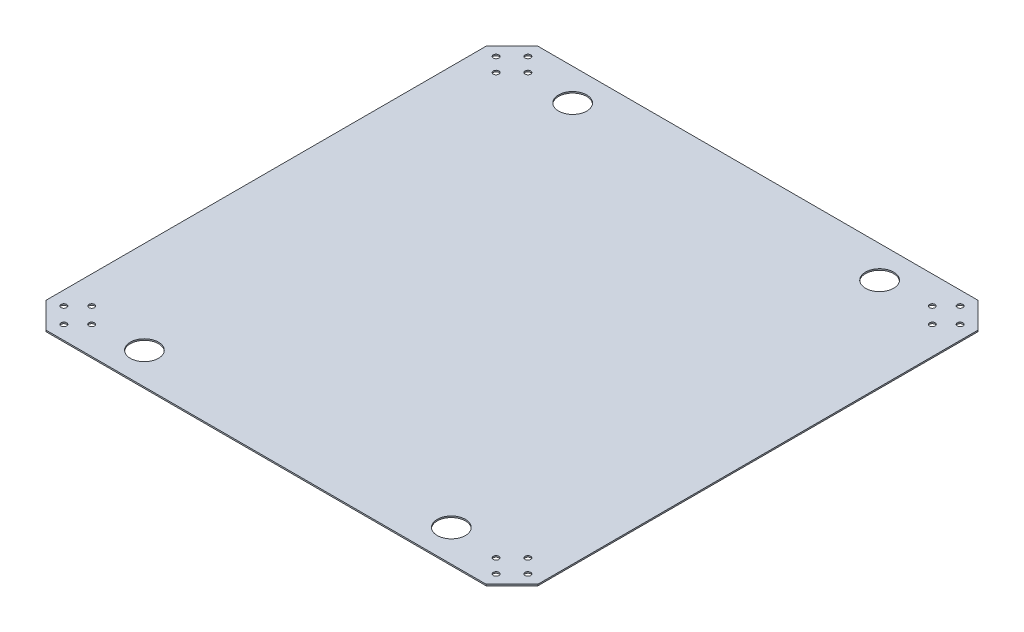
ISO-10303-21;
HEADER;
FILE_DESCRIPTION(('STEP AP214'),'2;1');
FILE_NAME('part.step','',(''),(''),'','','');
FILE_SCHEMA(('AUTOMOTIVE_DESIGN { 1 0 10303 214 1 1 1 1 }'));
ENDSEC;
DATA;
#1=APPLICATION_CONTEXT('core data for automotive mechanical design processes');
#2=APPLICATION_PROTOCOL_DEFINITION('international standard','automotive_design',2000,#1);
#3=PRODUCT_CONTEXT('',#1,'mechanical');
#4=PRODUCT('Part','Part','',(#3));
#5=PRODUCT_RELATED_PRODUCT_CATEGORY('part','',(#4));
#6=PRODUCT_DEFINITION_FORMATION('','',#4);
#7=PRODUCT_DEFINITION_CONTEXT('part definition',#1,'design');
#8=PRODUCT_DEFINITION('design','',#6,#7);
#9=PRODUCT_DEFINITION_SHAPE('','',#8);
#10=(LENGTH_UNIT() NAMED_UNIT(*) SI_UNIT(.MILLI.,.METRE.));
#11=(NAMED_UNIT(*) PLANE_ANGLE_UNIT() SI_UNIT($,.RADIAN.));
#12=(NAMED_UNIT(*) SI_UNIT($,.STERADIAN.) SOLID_ANGLE_UNIT());
#13=UNCERTAINTY_MEASURE_WITH_UNIT(LENGTH_MEASURE(1.E-05),#10,'distance_accuracy_value','');
#14=(GEOMETRIC_REPRESENTATION_CONTEXT(3) GLOBAL_UNCERTAINTY_ASSIGNED_CONTEXT((#13)) GLOBAL_UNIT_ASSIGNED_CONTEXT((#10,
#11,#12)) REPRESENTATION_CONTEXT('',''));
#15=CARTESIAN_POINT('',(0.,0.,0.));
#16=DIRECTION('',(0.,0.,1.));
#17=DIRECTION('',(1.,0.,0.));
#18=AXIS2_PLACEMENT_3D('',#15,#16,#17);
#19=CARTESIAN_POINT('',(0.,1.,174.999999999988));
#20=DIRECTION('',(0.,0.,-1.));
#21=DIRECTION('',(-1.,0.,0.));
#22=AXIS2_PLACEMENT_3D('',#19,#20,#21);
#23=PLANE('',#22);
#24=DIRECTION('',(1.,0.,0.));
#25=VECTOR('',#24,1.);
#26=CARTESIAN_POINT('',(0.,0.,174.999999999988));
#27=LINE('',#26,#25);
#28=CARTESIAN_POINT('',(-156.614999999998,0.,174.999999999989));
#29=VERTEX_POINT('',#28);
#30=CARTESIAN_POINT('',(156.615,0.,174.999999999988));
#31=VERTEX_POINT('',#30);
#32=EDGE_CURVE('E190',#29,#31,#27,.T.);
#33=ORIENTED_EDGE('',*,*,#32,.T.);
#34=DIRECTION('',(0.,-1.,0.));
#35=VECTOR('',#34,1.);
#36=CARTESIAN_POINT('',(156.615,1.,174.999999999988));
#37=LINE('',#36,#35);
#38=CARTESIAN_POINT('',(156.615,1.,174.999999999988));
#39=VERTEX_POINT('',#38);
#40=EDGE_CURVE('E11',#39,#31,#37,.T.);
#41=ORIENTED_EDGE('',*,*,#40,.F.);
#42=DIRECTION('',(1.,0.,0.));
#43=VECTOR('',#42,1.);
#44=CARTESIAN_POINT('',(0.,1.,174.999999999988));
#45=LINE('',#44,#43);
#46=CARTESIAN_POINT('',(-156.614999999998,1.,174.999999999989));
#47=VERTEX_POINT('',#46);
#48=EDGE_CURVE('E268',#47,#39,#45,.T.);
#49=ORIENTED_EDGE('',*,*,#48,.F.);
#50=DIRECTION('',(0.,-1.,0.));
#51=VECTOR('',#50,1.);
#52=CARTESIAN_POINT('',(-156.614999999998,1.,174.999999999989));
#53=LINE('',#52,#51);
#54=EDGE_CURVE('E189',#47,#29,#53,.T.);
#55=ORIENTED_EDGE('',*,*,#54,.T.);
#56=EDGE_LOOP('',(#33,#41,#49,#55));
#57=FACE_BOUND('',#56,.T.);
#58=ADVANCED_FACE('F34',(#57),#23,.F.);
#59=CARTESIAN_POINT('',(165.807500000004,1.,165.807500000004));
#60=DIRECTION('',(-0.707106781186547,0.,-0.707106781186547));
#61=DIRECTION('',(-0.707106781186548,0.,0.707106781186548));
#62=AXIS2_PLACEMENT_3D('',#59,#60,#61);
#63=PLANE('',#62);
#64=DIRECTION('',(0.707106781186548,0.,-0.707106781186548));
#65=VECTOR('',#64,1.);
#66=CARTESIAN_POINT('',(165.807500000004,0.,165.807500000004));
#67=LINE('',#66,#65);
#68=CARTESIAN_POINT('',(175.,0.,156.614999999988));
#69=VERTEX_POINT('',#68);
#70=EDGE_CURVE('E193',#31,#69,#67,.T.);
#71=ORIENTED_EDGE('',*,*,#70,.T.);
#72=DIRECTION('',(0.,-1.,0.));
#73=VECTOR('',#72,1.);
#74=CARTESIAN_POINT('',(175.,1.,156.614999999988));
#75=LINE('',#74,#73);
#76=CARTESIAN_POINT('',(175.,1.,156.614999999988));
#77=VERTEX_POINT('',#76);
#78=EDGE_CURVE('E42',#77,#69,#75,.T.);
#79=ORIENTED_EDGE('',*,*,#78,.F.);
#80=DIRECTION('',(0.707106781186548,0.,-0.707106781186548));
#81=VECTOR('',#80,1.);
#82=CARTESIAN_POINT('',(165.807500000004,1.,165.807500000004));
#83=LINE('',#82,#81);
#84=EDGE_CURVE('E93',#39,#77,#83,.T.);
#85=ORIENTED_EDGE('',*,*,#84,.F.);
#86=ORIENTED_EDGE('',*,*,#40,.T.);
#87=EDGE_LOOP('',(#71,#79,#85,#86));
#88=FACE_BOUND('',#87,.T.);
#89=ADVANCED_FACE('F281',(#88),#63,.F.);
#90=CARTESIAN_POINT('',(175.,1.,0.));
#91=DIRECTION('',(1.,0.,0.));
#92=DIRECTION('',(0.,0.,-1.));
#93=AXIS2_PLACEMENT_3D('',#90,#91,#92);
#94=PLANE('',#93);
#95=DIRECTION('',(0.,0.,1.));
#96=VECTOR('',#95,1.);
#97=CARTESIAN_POINT('',(175.,0.,0.));
#98=LINE('',#97,#96);
#99=CARTESIAN_POINT('',(175.,0.,-156.61500000001));
#100=VERTEX_POINT('',#99);
#101=EDGE_CURVE('E196',#100,#69,#98,.T.);
#102=ORIENTED_EDGE('',*,*,#101,.F.);
#103=DIRECTION('',(0.,-1.,0.));
#104=VECTOR('',#103,1.);
#105=CARTESIAN_POINT('',(175.,1.,-156.61500000001));
#106=LINE('',#105,#104);
#107=CARTESIAN_POINT('',(175.,1.,-156.61500000001));
#108=VERTEX_POINT('',#107);
#109=EDGE_CURVE('E274',#108,#100,#106,.T.);
#110=ORIENTED_EDGE('',*,*,#109,.F.);
#111=DIRECTION('',(0.,0.,1.));
#112=VECTOR('',#111,1.);
#113=CARTESIAN_POINT('',(175.,1.,0.));
#114=LINE('',#113,#112);
#115=EDGE_CURVE('E280',#108,#77,#114,.T.);
#116=ORIENTED_EDGE('',*,*,#115,.T.);
#117=ORIENTED_EDGE('',*,*,#78,.T.);
#118=EDGE_LOOP('',(#102,#110,#116,#117));
#119=FACE_BOUND('',#118,.T.);
#120=ADVANCED_FACE('F278',(#119),#94,.T.);
#121=CARTESIAN_POINT('',(165.807500000008,1.,-165.807500000008));
#122=DIRECTION('',(-0.707106781186547,0.,0.707106781186547));
#123=DIRECTION('',(0.707106781186548,0.,0.707106781186548));
#124=AXIS2_PLACEMENT_3D('',#121,#122,#123);
#125=PLANE('',#124);
#126=DIRECTION('',(-0.707106781186548,0.,-0.707106781186548));
#127=VECTOR('',#126,1.);
#128=CARTESIAN_POINT('',(165.807500000008,0.,-165.807500000008));
#129=LINE('',#128,#127);
#130=CARTESIAN_POINT('',(156.615,0.,-175.00000000001));
#131=VERTEX_POINT('',#130);
#132=EDGE_CURVE('E199',#100,#131,#129,.T.);
#133=ORIENTED_EDGE('',*,*,#132,.T.);
#134=DIRECTION('',(0.,-1.,0.));
#135=VECTOR('',#134,1.);
#136=CARTESIAN_POINT('',(156.615,1.,-175.00000000001));
#137=LINE('',#136,#135);
#138=CARTESIAN_POINT('',(156.615,1.,-175.00000000001));
#139=VERTEX_POINT('',#138);
#140=EDGE_CURVE('E272',#139,#131,#137,.T.);
#141=ORIENTED_EDGE('',*,*,#140,.F.);
#142=DIRECTION('',(-0.707106781186548,0.,-0.707106781186548));
#143=VECTOR('',#142,1.);
#144=CARTESIAN_POINT('',(165.807500000008,1.,-165.807500000008));
#145=LINE('',#144,#143);
#146=EDGE_CURVE('E293',#108,#139,#145,.T.);
#147=ORIENTED_EDGE('',*,*,#146,.F.);
#148=ORIENTED_EDGE('',*,*,#109,.T.);
#149=EDGE_LOOP('',(#133,#141,#147,#148));
#150=FACE_BOUND('',#149,.T.);
#151=ADVANCED_FACE('F291',(#150),#125,.F.);
#152=CARTESIAN_POINT('',(0.,1.,-175.00000000001));
#153=DIRECTION('',(0.,0.,-1.));
#154=DIRECTION('',(-1.,0.,0.));
#155=AXIS2_PLACEMENT_3D('',#152,#153,#154);
#156=PLANE('',#155);
#157=DIRECTION('',(1.,0.,0.));
#158=VECTOR('',#157,1.);
#159=CARTESIAN_POINT('',(0.,0.,-175.00000000001));
#160=LINE('',#159,#158);
#161=CARTESIAN_POINT('',(-156.614999999999,0.,-175.00000000001));
#162=VERTEX_POINT('',#161);
#163=EDGE_CURVE('E202',#162,#131,#160,.T.);
#164=ORIENTED_EDGE('',*,*,#163,.F.);
#165=DIRECTION('',(0.,-1.,0.));
#166=VECTOR('',#165,1.);
#167=CARTESIAN_POINT('',(-156.614999999999,1.,-175.00000000001));
#168=LINE('',#167,#166);
#169=CARTESIAN_POINT('',(-156.614999999999,1.,-175.00000000001));
#170=VERTEX_POINT('',#169);
#171=EDGE_CURVE('E121',#170,#162,#168,.T.);
#172=ORIENTED_EDGE('',*,*,#171,.F.);
#173=DIRECTION('',(1.,0.,0.));
#174=VECTOR('',#173,1.);
#175=CARTESIAN_POINT('',(0.,1.,-175.00000000001));
#176=LINE('',#175,#174);
#177=EDGE_CURVE('E114',#170,#139,#176,.T.);
#178=ORIENTED_EDGE('',*,*,#177,.T.);
#179=ORIENTED_EDGE('',*,*,#140,.T.);
#180=EDGE_LOOP('',(#164,#172,#178,#179));
#181=FACE_BOUND('',#180,.T.);
#182=ADVANCED_FACE('F299',(#181),#156,.T.);
#183=CARTESIAN_POINT('',(-165.807500000004,1.,-165.807500000004));
#184=DIRECTION('',(0.707106781186547,0.,0.707106781186547));
#185=DIRECTION('',(0.707106781186548,0.,-0.707106781186548));
#186=AXIS2_PLACEMENT_3D('',#183,#184,#185);
#187=PLANE('',#186);
#188=DIRECTION('',(-0.707106781186548,0.,0.707106781186548));
#189=VECTOR('',#188,1.);
#190=CARTESIAN_POINT('',(-165.807500000004,0.,-165.807500000004));
#191=LINE('',#190,#189);
#192=CARTESIAN_POINT('',(-174.999999999999,0.,-156.61500000001));
#193=VERTEX_POINT('',#192);
#194=EDGE_CURVE('E120',#162,#193,#191,.T.);
#195=ORIENTED_EDGE('',*,*,#194,.T.);
#196=DIRECTION('',(0.,-1.,0.));
#197=VECTOR('',#196,1.);
#198=CARTESIAN_POINT('',(-174.999999999999,1.,-156.61500000001));
#199=LINE('',#198,#197);
#200=CARTESIAN_POINT('',(-174.999999999999,1.,-156.61500000001));
#201=VERTEX_POINT('',#200);
#202=EDGE_CURVE('E117',#201,#193,#199,.T.);
#203=ORIENTED_EDGE('',*,*,#202,.F.);
#204=DIRECTION('',(-0.707106781186548,0.,0.707106781186548));
#205=VECTOR('',#204,1.);
#206=CARTESIAN_POINT('',(-165.807500000004,1.,-165.807500000004));
#207=LINE('',#206,#205);
#208=EDGE_CURVE('E107',#170,#201,#207,.T.);
#209=ORIENTED_EDGE('',*,*,#208,.F.);
#210=ORIENTED_EDGE('',*,*,#171,.T.);
#211=EDGE_LOOP('',(#195,#203,#209,#210));
#212=FACE_BOUND('',#211,.T.);
#213=ADVANCED_FACE('F118',(#212),#187,.F.);
#214=CARTESIAN_POINT('',(-174.999999999999,1.,0.));
#215=DIRECTION('',(1.,0.,0.));
#216=DIRECTION('',(0.,0.,-1.));
#217=AXIS2_PLACEMENT_3D('',#214,#215,#216);
#218=PLANE('',#217);
#219=DIRECTION('',(0.,0.,1.));
#220=VECTOR('',#219,1.);
#221=CARTESIAN_POINT('',(-174.999999999999,0.,0.));
#222=LINE('',#221,#220);
#223=CARTESIAN_POINT('',(-174.999999999999,0.,156.614999999989));
#224=VERTEX_POINT('',#223);
#225=EDGE_CURVE('E79',#193,#224,#222,.T.);
#226=ORIENTED_EDGE('',*,*,#225,.T.);
#227=DIRECTION('',(0.,-1.,0.));
#228=VECTOR('',#227,1.);
#229=CARTESIAN_POINT('',(-174.999999999999,1.,156.614999999989));
#230=LINE('',#229,#228);
#231=CARTESIAN_POINT('',(-174.999999999999,1.,156.614999999989));
#232=VERTEX_POINT('',#231);
#233=EDGE_CURVE('E122',#232,#224,#230,.T.);
#234=ORIENTED_EDGE('',*,*,#233,.F.);
#235=DIRECTION('',(0.,0.,1.));
#236=VECTOR('',#235,1.);
#237=CARTESIAN_POINT('',(-174.999999999999,1.,0.));
#238=LINE('',#237,#236);
#239=EDGE_CURVE('E112',#201,#232,#238,.T.);
#240=ORIENTED_EDGE('',*,*,#239,.F.);
#241=ORIENTED_EDGE('',*,*,#202,.T.);
#242=EDGE_LOOP('',(#226,#234,#240,#241));
#243=FACE_BOUND('',#242,.T.);
#244=ADVANCED_FACE('F124',(#243),#218,.F.);
#245=CARTESIAN_POINT('',(153.786572875261,1.,165.10050506338));
#246=DIRECTION('',(0.,-1.,0.));
#247=DIRECTION('',(0.,0.,-1.));
#248=AXIS2_PLACEMENT_3D('',#245,#246,#247);
#249=CYLINDRICAL_SURFACE('',#248,2.00000000000411);
#250=CARTESIAN_POINT('',(153.786572875261,1.,165.10050506338));
#251=DIRECTION('',(0.,1.,0.));
#252=DIRECTION('',(0.,0.,1.));
#253=AXIS2_PLACEMENT_3D('',#250,#251,#252);
#254=CIRCLE('',#253,2.00000000000411);
#255=CARTESIAN_POINT('',(153.786572875261,1.,167.100505063384));
#256=VERTEX_POINT('',#255);
#257=EDGE_CURVE('E183',#256,#256,#254,.T.);
#258=ORIENTED_EDGE('',*,*,#257,.T.);
#259=EDGE_LOOP('',(#258));
#260=FACE_BOUND('',#259,.T.);
#261=CARTESIAN_POINT('',(153.786572875261,0.,165.10050506338));
#262=DIRECTION('',(0.,1.,0.));
#263=DIRECTION('',(0.,0.,1.));
#264=AXIS2_PLACEMENT_3D('',#261,#262,#263);
#265=CIRCLE('',#264,2.00000000000411);
#266=CARTESIAN_POINT('',(153.786572875261,0.,167.100505063384));
#267=VERTEX_POINT('',#266);
#268=EDGE_CURVE('E262',#267,#267,#265,.T.);
#269=ORIENTED_EDGE('',*,*,#268,.F.);
#270=EDGE_LOOP('',(#269));
#271=FACE_BOUND('',#270,.T.);
#272=ADVANCED_FACE('F332',(#260,#271),#249,.F.);
#273=CARTESIAN_POINT('',(155.201010126783,1.,143.887077938643));
#274=DIRECTION('',(0.,-1.,0.));
#275=DIRECTION('',(0.,0.,-1.));
#276=AXIS2_PLACEMENT_3D('',#273,#274,#275);
#277=CYLINDRICAL_SURFACE('',#276,1.99999999999611);
#278=CARTESIAN_POINT('',(155.201010126783,1.,143.887077938643));
#279=DIRECTION('',(0.,1.,0.));
#280=DIRECTION('',(0.,0.,1.));
#281=AXIS2_PLACEMENT_3D('',#278,#279,#280);
#282=CIRCLE('',#281,1.99999999999611);
#283=CARTESIAN_POINT('',(155.201010126783,1.,145.887077938639));
#284=VERTEX_POINT('',#283);
#285=EDGE_CURVE('E180',#284,#284,#282,.T.);
#286=ORIENTED_EDGE('',*,*,#285,.T.);
#287=EDGE_LOOP('',(#286));
#288=FACE_BOUND('',#287,.T.);
#289=CARTESIAN_POINT('',(155.201010126783,0.,143.887077938643));
#290=DIRECTION('',(0.,1.,0.));
#291=DIRECTION('',(0.,0.,1.));
#292=AXIS2_PLACEMENT_3D('',#289,#290,#291);
#293=CIRCLE('',#292,1.99999999999611);
#294=CARTESIAN_POINT('',(155.201010126783,0.,145.887077938639));
#295=VERTEX_POINT('',#294);
#296=EDGE_CURVE('E259',#295,#295,#293,.T.);
#297=ORIENTED_EDGE('',*,*,#296,.F.);
#298=EDGE_LOOP('',(#297));
#299=FACE_BOUND('',#298,.T.);
#300=ADVANCED_FACE('F336',(#288,#299),#277,.F.);
#301=CARTESIAN_POINT('',(143.8873016278,1.,155.200786437618));
#302=DIRECTION('',(0.,-1.,0.));
#303=DIRECTION('',(0.,0.,-1.));
#304=AXIS2_PLACEMENT_3D('',#301,#302,#303);
#305=CYLINDRICAL_SURFACE('',#304,2.00000000001105);
#306=CARTESIAN_POINT('',(143.8873016278,1.,155.200786437618));
#307=DIRECTION('',(0.,1.,0.));
#308=DIRECTION('',(0.,0.,1.));
#309=AXIS2_PLACEMENT_3D('',#306,#307,#308);
#310=CIRCLE('',#309,2.00000000001105);
#311=CARTESIAN_POINT('',(143.8873016278,1.,157.200786437629));
#312=VERTEX_POINT('',#311);
#313=EDGE_CURVE('E177',#312,#312,#310,.T.);
#314=ORIENTED_EDGE('',*,*,#313,.T.);
#315=EDGE_LOOP('',(#314));
#316=FACE_BOUND('',#315,.T.);
#317=CARTESIAN_POINT('',(143.8873016278,0.,155.200786437618));
#318=DIRECTION('',(0.,1.,0.));
#319=DIRECTION('',(0.,0.,1.));
#320=AXIS2_PLACEMENT_3D('',#317,#318,#319);
#321=CIRCLE('',#320,2.00000000001105);
#322=CARTESIAN_POINT('',(143.8873016278,0.,157.200786437629));
#323=VERTEX_POINT('',#322);
#324=EDGE_CURVE('E256',#323,#323,#321,.T.);
#325=ORIENTED_EDGE('',*,*,#324,.F.);
#326=EDGE_LOOP('',(#325));
#327=FACE_BOUND('',#326,.T.);
#328=ADVANCED_FACE('F342',(#316,#327),#305,.F.);
#329=CARTESIAN_POINT('',(153.786572875263,1.,-165.100505063395));
#330=DIRECTION('',(0.,-1.,0.));
#331=DIRECTION('',(0.,0.,-1.));
#332=AXIS2_PLACEMENT_3D('',#329,#330,#331);
#333=CYLINDRICAL_SURFACE('',#332,1.99999999999599);
#334=CARTESIAN_POINT('',(153.786572875263,1.,-165.100505063395));
#335=DIRECTION('',(0.,1.,0.));
#336=DIRECTION('',(0.,0.,1.));
#337=AXIS2_PLACEMENT_3D('',#334,#335,#336);
#338=CIRCLE('',#337,1.99999999999599);
#339=CARTESIAN_POINT('',(153.786572875263,1.,-163.100505063399));
#340=VERTEX_POINT('',#339);
#341=EDGE_CURVE('E174',#340,#340,#338,.T.);
#342=ORIENTED_EDGE('',*,*,#341,.T.);
#343=EDGE_LOOP('',(#342));
#344=FACE_BOUND('',#343,.T.);
#345=CARTESIAN_POINT('',(153.786572875263,0.,-165.100505063395));
#346=DIRECTION('',(0.,1.,0.));
#347=DIRECTION('',(0.,0.,1.));
#348=AXIS2_PLACEMENT_3D('',#345,#346,#347);
#349=CIRCLE('',#348,1.99999999999599);
#350=CARTESIAN_POINT('',(153.786572875263,0.,-163.100505063399));
#351=VERTEX_POINT('',#350);
#352=EDGE_CURVE('E253',#351,#351,#349,.T.);
#353=ORIENTED_EDGE('',*,*,#352,.F.);
#354=EDGE_LOOP('',(#353));
#355=FACE_BOUND('',#354,.T.);
#356=ADVANCED_FACE('F350',(#344,#355),#333,.F.);
#357=CARTESIAN_POINT('',(165.100505063388,1.,-153.786572875262));
#358=DIRECTION('',(0.,-1.,0.));
#359=DIRECTION('',(0.,0.,-1.));
#360=AXIS2_PLACEMENT_3D('',#357,#358,#359);
#361=CYLINDRICAL_SURFACE('',#360,2.00000000000411);
#362=CARTESIAN_POINT('',(165.100505063388,1.,-153.786572875262));
#363=DIRECTION('',(0.,1.,0.));
#364=DIRECTION('',(0.,0.,1.));
#365=AXIS2_PLACEMENT_3D('',#362,#363,#364);
#366=CIRCLE('',#365,2.00000000000411);
#367=CARTESIAN_POINT('',(165.100505063388,1.,-151.786572875258));
#368=VERTEX_POINT('',#367);
#369=EDGE_CURVE('E171',#368,#368,#366,.T.);
#370=ORIENTED_EDGE('',*,*,#369,.T.);
#371=EDGE_LOOP('',(#370));
#372=FACE_BOUND('',#371,.T.);
#373=CARTESIAN_POINT('',(165.100505063388,0.,-153.786572875262));
#374=DIRECTION('',(0.,1.,0.));
#375=DIRECTION('',(0.,0.,1.));
#376=AXIS2_PLACEMENT_3D('',#373,#374,#375);
#377=CIRCLE('',#376,2.00000000000411);
#378=CARTESIAN_POINT('',(165.100505063388,0.,-151.786572875258));
#379=VERTEX_POINT('',#378);
#380=EDGE_CURVE('E250',#379,#379,#377,.T.);
#381=ORIENTED_EDGE('',*,*,#380,.F.);
#382=EDGE_LOOP('',(#381));
#383=FACE_BOUND('',#382,.T.);
#384=ADVANCED_FACE('F354',(#372,#383),#361,.F.);
#385=CARTESIAN_POINT('',(143.887077938651,1.,-155.201010126784));
#386=DIRECTION('',(0.,-1.,0.));
#387=DIRECTION('',(0.,0.,-1.));
#388=AXIS2_PLACEMENT_3D('',#385,#386,#387);
#389=CYLINDRICAL_SURFACE('',#388,1.99999999999611);
#390=CARTESIAN_POINT('',(143.887077938651,1.,-155.201010126784));
#391=DIRECTION('',(0.,1.,0.));
#392=DIRECTION('',(0.,0.,1.));
#393=AXIS2_PLACEMENT_3D('',#390,#391,#392);
#394=CIRCLE('',#393,1.99999999999611);
#395=CARTESIAN_POINT('',(143.887077938651,1.,-153.201010126788));
#396=VERTEX_POINT('',#395);
#397=EDGE_CURVE('E168',#396,#396,#394,.T.);
#398=ORIENTED_EDGE('',*,*,#397,.T.);
#399=EDGE_LOOP('',(#398));
#400=FACE_BOUND('',#399,.T.);
#401=CARTESIAN_POINT('',(143.887077938651,0.,-155.201010126784));
#402=DIRECTION('',(0.,1.,0.));
#403=DIRECTION('',(0.,0.,1.));
#404=AXIS2_PLACEMENT_3D('',#401,#402,#403);
#405=CIRCLE('',#404,1.99999999999611);
#406=CARTESIAN_POINT('',(143.887077938651,0.,-153.201010126788));
#407=VERTEX_POINT('',#406);
#408=EDGE_CURVE('E247',#407,#407,#405,.T.);
#409=ORIENTED_EDGE('',*,*,#408,.F.);
#410=EDGE_LOOP('',(#409));
#411=FACE_BOUND('',#410,.T.);
#412=ADVANCED_FACE('F358',(#400,#411),#389,.F.);
#413=CARTESIAN_POINT('',(155.200786437626,1.,-143.8873016278));
#414=DIRECTION('',(0.,-1.,0.));
#415=DIRECTION('',(0.,0.,-1.));
#416=AXIS2_PLACEMENT_3D('',#413,#414,#415);
#417=CYLINDRICAL_SURFACE('',#416,2.00000000000845);
#418=CARTESIAN_POINT('',(155.200786437626,1.,-143.8873016278));
#419=DIRECTION('',(0.,1.,0.));
#420=DIRECTION('',(0.,0.,1.));
#421=AXIS2_PLACEMENT_3D('',#418,#419,#420);
#422=CIRCLE('',#421,2.00000000000845);
#423=CARTESIAN_POINT('',(155.200786437626,1.,-141.887301627792));
#424=VERTEX_POINT('',#423);
#425=EDGE_CURVE('E165',#424,#424,#422,.T.);
#426=ORIENTED_EDGE('',*,*,#425,.T.);
#427=EDGE_LOOP('',(#426));
#428=FACE_BOUND('',#427,.T.);
#429=CARTESIAN_POINT('',(155.200786437626,0.,-143.8873016278));
#430=DIRECTION('',(0.,1.,0.));
#431=DIRECTION('',(0.,0.,1.));
#432=AXIS2_PLACEMENT_3D('',#429,#430,#431);
#433=CIRCLE('',#432,2.00000000000845);
#434=CARTESIAN_POINT('',(155.200786437626,0.,-141.887301627792));
#435=VERTEX_POINT('',#434);
#436=EDGE_CURVE('E244',#435,#435,#433,.T.);
#437=ORIENTED_EDGE('',*,*,#436,.F.);
#438=EDGE_LOOP('',(#437));
#439=FACE_BOUND('',#438,.T.);
#440=ADVANCED_FACE('F362',(#428,#439),#417,.F.);
#441=CARTESIAN_POINT('',(-165.100505063387,1.,-153.786572875264));
#442=DIRECTION('',(0.,-1.,0.));
#443=DIRECTION('',(0.,0.,-1.));
#444=AXIS2_PLACEMENT_3D('',#441,#442,#443);
#445=CYLINDRICAL_SURFACE('',#444,1.99999999999599);
#446=CARTESIAN_POINT('',(-165.100505063387,1.,-153.786572875264));
#447=DIRECTION('',(0.,1.,0.));
#448=DIRECTION('',(0.,0.,1.));
#449=AXIS2_PLACEMENT_3D('',#446,#447,#448);
#450=CIRCLE('',#449,1.99999999999599);
#451=CARTESIAN_POINT('',(-165.100505063387,1.,-151.786572875268));
#452=VERTEX_POINT('',#451);
#453=EDGE_CURVE('E162',#452,#452,#450,.T.);
#454=ORIENTED_EDGE('',*,*,#453,.T.);
#455=EDGE_LOOP('',(#454));
#456=FACE_BOUND('',#455,.T.);
#457=CARTESIAN_POINT('',(-165.100505063387,0.,-153.786572875264));
#458=DIRECTION('',(0.,1.,0.));
#459=DIRECTION('',(0.,0.,1.));
#460=AXIS2_PLACEMENT_3D('',#457,#458,#459);
#461=CIRCLE('',#460,1.99999999999599);
#462=CARTESIAN_POINT('',(-165.100505063387,0.,-151.786572875268));
#463=VERTEX_POINT('',#462);
#464=EDGE_CURVE('E241',#463,#463,#461,.T.);
#465=ORIENTED_EDGE('',*,*,#464,.F.);
#466=EDGE_LOOP('',(#465));
#467=FACE_BOUND('',#466,.T.);
#468=ADVANCED_FACE('F366',(#456,#467),#445,.F.);
#469=CARTESIAN_POINT('',(-153.786572875254,1.,-165.100505063388));
#470=DIRECTION('',(0.,-1.,0.));
#471=DIRECTION('',(0.,0.,-1.));
#472=AXIS2_PLACEMENT_3D('',#469,#470,#471);
#473=CYLINDRICAL_SURFACE('',#472,2.00000000000411);
#474=CARTESIAN_POINT('',(-153.786572875254,1.,-165.100505063388));
#475=DIRECTION('',(0.,1.,0.));
#476=DIRECTION('',(0.,0.,1.));
#477=AXIS2_PLACEMENT_3D('',#474,#475,#476);
#478=CIRCLE('',#477,2.00000000000411);
#479=CARTESIAN_POINT('',(-153.786572875254,1.,-163.100505063384));
#480=VERTEX_POINT('',#479);
#481=EDGE_CURVE('E159',#480,#480,#478,.T.);
#482=ORIENTED_EDGE('',*,*,#481,.T.);
#483=EDGE_LOOP('',(#482));
#484=FACE_BOUND('',#483,.T.);
#485=CARTESIAN_POINT('',(-153.786572875254,0.,-165.100505063388));
#486=DIRECTION('',(0.,1.,0.));
#487=DIRECTION('',(0.,0.,1.));
#488=AXIS2_PLACEMENT_3D('',#485,#486,#487);
#489=CIRCLE('',#488,2.00000000000411);
#490=CARTESIAN_POINT('',(-153.786572875254,0.,-163.100505063384));
#491=VERTEX_POINT('',#490);
#492=EDGE_CURVE('E238',#491,#491,#489,.T.);
#493=ORIENTED_EDGE('',*,*,#492,.F.);
#494=EDGE_LOOP('',(#493));
#495=FACE_BOUND('',#494,.T.);
#496=ADVANCED_FACE('F370',(#484,#495),#473,.F.);
#497=CARTESIAN_POINT('',(-155.201010126776,1.,-143.887077938652));
#498=DIRECTION('',(0.,-1.,0.));
#499=DIRECTION('',(0.,0.,-1.));
#500=AXIS2_PLACEMENT_3D('',#497,#498,#499);
#501=CYLINDRICAL_SURFACE('',#500,1.99999999999611);
#502=CARTESIAN_POINT('',(-155.201010126776,1.,-143.887077938652));
#503=DIRECTION('',(0.,1.,0.));
#504=DIRECTION('',(0.,0.,1.));
#505=AXIS2_PLACEMENT_3D('',#502,#503,#504);
#506=CIRCLE('',#505,1.99999999999611);
#507=CARTESIAN_POINT('',(-155.201010126776,1.,-141.887077938656));
#508=VERTEX_POINT('',#507);
#509=EDGE_CURVE('E156',#508,#508,#506,.T.);
#510=ORIENTED_EDGE('',*,*,#509,.T.);
#511=EDGE_LOOP('',(#510));
#512=FACE_BOUND('',#511,.T.);
#513=CARTESIAN_POINT('',(-155.201010126776,0.,-143.887077938652));
#514=DIRECTION('',(0.,1.,0.));
#515=DIRECTION('',(0.,0.,1.));
#516=AXIS2_PLACEMENT_3D('',#513,#514,#515);
#517=CIRCLE('',#516,1.99999999999611);
#518=CARTESIAN_POINT('',(-155.201010126776,0.,-141.887077938656));
#519=VERTEX_POINT('',#518);
#520=EDGE_CURVE('E235',#519,#519,#517,.T.);
#521=ORIENTED_EDGE('',*,*,#520,.F.);
#522=EDGE_LOOP('',(#521));
#523=FACE_BOUND('',#522,.T.);
#524=ADVANCED_FACE('F374',(#512,#523),#501,.F.);
#525=CARTESIAN_POINT('',(-143.887301627792,1.,-155.200786437627));
#526=DIRECTION('',(0.,-1.,0.));
#527=DIRECTION('',(0.,0.,-1.));
#528=AXIS2_PLACEMENT_3D('',#525,#526,#527);
#529=CYLINDRICAL_SURFACE('',#528,2.);
#530=CARTESIAN_POINT('',(-143.887301627792,1.,-155.200786437627));
#531=DIRECTION('',(0.,1.,0.));
#532=DIRECTION('',(0.,0.,1.));
#533=AXIS2_PLACEMENT_3D('',#530,#531,#532);
#534=CIRCLE('',#533,2.);
#535=CARTESIAN_POINT('',(-143.887301627792,1.,-153.200786437627));
#536=VERTEX_POINT('',#535);
#537=EDGE_CURVE('E153',#536,#536,#534,.T.);
#538=ORIENTED_EDGE('',*,*,#537,.T.);
#539=EDGE_LOOP('',(#538));
#540=FACE_BOUND('',#539,.T.);
#541=CARTESIAN_POINT('',(-143.887301627792,0.,-155.200786437627));
#542=DIRECTION('',(0.,1.,0.));
#543=DIRECTION('',(0.,0.,1.));
#544=AXIS2_PLACEMENT_3D('',#541,#542,#543);
#545=CIRCLE('',#544,2.);
#546=CARTESIAN_POINT('',(-143.887301627792,0.,-153.200786437627));
#547=VERTEX_POINT('',#546);
#548=EDGE_CURVE('E232',#547,#547,#545,.T.);
#549=ORIENTED_EDGE('',*,*,#548,.F.);
#550=EDGE_LOOP('',(#549));
#551=FACE_BOUND('',#550,.T.);
#552=ADVANCED_FACE('F378',(#540,#551),#529,.F.);
#553=CARTESIAN_POINT('',(-153.786572875256,1.,165.100505063387));
#554=DIRECTION('',(0.,-1.,0.));
#555=DIRECTION('',(0.,0.,-1.));
#556=AXIS2_PLACEMENT_3D('',#553,#554,#555);
#557=CYLINDRICAL_SURFACE('',#556,1.99999999999599);
#558=CARTESIAN_POINT('',(-153.786572875256,1.,165.100505063387));
#559=DIRECTION('',(0.,1.,0.));
#560=DIRECTION('',(0.,0.,1.));
#561=AXIS2_PLACEMENT_3D('',#558,#559,#560);
#562=CIRCLE('',#561,1.99999999999599);
#563=CARTESIAN_POINT('',(-153.786572875256,1.,167.100505063383));
#564=VERTEX_POINT('',#563);
#565=EDGE_CURVE('E150',#564,#564,#562,.T.);
#566=ORIENTED_EDGE('',*,*,#565,.T.);
#567=EDGE_LOOP('',(#566));
#568=FACE_BOUND('',#567,.T.);
#569=CARTESIAN_POINT('',(-153.786572875256,0.,165.100505063387));
#570=DIRECTION('',(0.,1.,0.));
#571=DIRECTION('',(0.,0.,1.));
#572=AXIS2_PLACEMENT_3D('',#569,#570,#571);
#573=CIRCLE('',#572,1.99999999999599);
#574=CARTESIAN_POINT('',(-153.786572875256,0.,167.100505063383));
#575=VERTEX_POINT('',#574);
#576=EDGE_CURVE('E229',#575,#575,#573,.T.);
#577=ORIENTED_EDGE('',*,*,#576,.F.);
#578=EDGE_LOOP('',(#577));
#579=FACE_BOUND('',#578,.T.);
#580=ADVANCED_FACE('F382',(#568,#579),#557,.F.);
#581=CARTESIAN_POINT('',(-165.10050506338,1.,153.786572875253));
#582=DIRECTION('',(0.,-1.,0.));
#583=DIRECTION('',(0.,0.,-1.));
#584=AXIS2_PLACEMENT_3D('',#581,#582,#583);
#585=CYLINDRICAL_SURFACE('',#584,2.00000000000411);
#586=CARTESIAN_POINT('',(-165.10050506338,1.,153.786572875253));
#587=DIRECTION('',(0.,1.,0.));
#588=DIRECTION('',(0.,0.,1.));
#589=AXIS2_PLACEMENT_3D('',#586,#587,#588);
#590=CIRCLE('',#589,2.00000000000411);
#591=CARTESIAN_POINT('',(-165.10050506338,1.,155.786572875258));
#592=VERTEX_POINT('',#591);
#593=EDGE_CURVE('E147',#592,#592,#590,.T.);
#594=ORIENTED_EDGE('',*,*,#593,.T.);
#595=EDGE_LOOP('',(#594));
#596=FACE_BOUND('',#595,.T.);
#597=CARTESIAN_POINT('',(-165.10050506338,0.,153.786572875253));
#598=DIRECTION('',(0.,1.,0.));
#599=DIRECTION('',(0.,0.,1.));
#600=AXIS2_PLACEMENT_3D('',#597,#598,#599);
#601=CIRCLE('',#600,2.00000000000411);
#602=CARTESIAN_POINT('',(-165.10050506338,0.,155.786572875258));
#603=VERTEX_POINT('',#602);
#604=EDGE_CURVE('E226',#603,#603,#601,.T.);
#605=ORIENTED_EDGE('',*,*,#604,.F.);
#606=EDGE_LOOP('',(#605));
#607=FACE_BOUND('',#606,.T.);
#608=ADVANCED_FACE('F386',(#596,#607),#585,.F.);
#609=CARTESIAN_POINT('',(-143.887077938644,1.,155.201010126775));
#610=DIRECTION('',(0.,-1.,0.));
#611=DIRECTION('',(0.,0.,-1.));
#612=AXIS2_PLACEMENT_3D('',#609,#610,#611);
#613=CYLINDRICAL_SURFACE('',#612,1.99999999999611);
#614=CARTESIAN_POINT('',(-143.887077938644,1.,155.201010126775));
#615=DIRECTION('',(0.,1.,0.));
#616=DIRECTION('',(0.,0.,1.));
#617=AXIS2_PLACEMENT_3D('',#614,#615,#616);
#618=CIRCLE('',#617,1.99999999999611);
#619=CARTESIAN_POINT('',(-143.887077938644,1.,157.201010126771));
#620=VERTEX_POINT('',#619);
#621=EDGE_CURVE('E144',#620,#620,#618,.T.);
#622=ORIENTED_EDGE('',*,*,#621,.T.);
#623=EDGE_LOOP('',(#622));
#624=FACE_BOUND('',#623,.T.);
#625=CARTESIAN_POINT('',(-143.887077938644,0.,155.201010126775));
#626=DIRECTION('',(0.,1.,0.));
#627=DIRECTION('',(0.,0.,1.));
#628=AXIS2_PLACEMENT_3D('',#625,#626,#627);
#629=CIRCLE('',#628,1.99999999999611);
#630=CARTESIAN_POINT('',(-143.887077938644,0.,157.201010126771));
#631=VERTEX_POINT('',#630);
#632=EDGE_CURVE('E223',#631,#631,#629,.T.);
#633=ORIENTED_EDGE('',*,*,#632,.F.);
#634=EDGE_LOOP('',(#633));
#635=FACE_BOUND('',#634,.T.);
#636=ADVANCED_FACE('F390',(#624,#635),#613,.F.);
#637=CARTESIAN_POINT('',(-155.200786437619,1.,143.887301627792));
#638=DIRECTION('',(0.,-1.,0.));
#639=DIRECTION('',(0.,0.,-1.));
#640=AXIS2_PLACEMENT_3D('',#637,#638,#639);
#641=CYLINDRICAL_SURFACE('',#640,2.00000000000397);
#642=CARTESIAN_POINT('',(-155.200786437619,1.,143.887301627792));
#643=DIRECTION('',(0.,1.,0.));
#644=DIRECTION('',(0.,0.,1.));
#645=AXIS2_PLACEMENT_3D('',#642,#643,#644);
#646=CIRCLE('',#645,2.00000000000397);
#647=CARTESIAN_POINT('',(-155.200786437619,1.,145.887301627796));
#648=VERTEX_POINT('',#647);
#649=EDGE_CURVE('E141',#648,#648,#646,.T.);
#650=ORIENTED_EDGE('',*,*,#649,.T.);
#651=EDGE_LOOP('',(#650));
#652=FACE_BOUND('',#651,.T.);
#653=CARTESIAN_POINT('',(-155.200786437619,0.,143.887301627792));
#654=DIRECTION('',(0.,1.,0.));
#655=DIRECTION('',(0.,0.,1.));
#656=AXIS2_PLACEMENT_3D('',#653,#654,#655);
#657=CIRCLE('',#656,2.00000000000397);
#658=CARTESIAN_POINT('',(-155.200786437619,0.,145.887301627796));
#659=VERTEX_POINT('',#658);
#660=EDGE_CURVE('E220',#659,#659,#657,.T.);
#661=ORIENTED_EDGE('',*,*,#660,.F.);
#662=EDGE_LOOP('',(#661));
#663=FACE_BOUND('',#662,.T.);
#664=ADVANCED_FACE('F394',(#652,#663),#641,.F.);
#665=CARTESIAN_POINT('',(-109.204108060851,1.,152.372583002019));
#666=DIRECTION('',(0.,-1.,0.));
#667=DIRECTION('',(0.,0.,-1.));
#668=AXIS2_PLACEMENT_3D('',#665,#666,#667);
#669=CYLINDRICAL_SURFACE('',#668,10.);
#670=CARTESIAN_POINT('',(-109.204108060851,1.,152.372583002019));
#671=DIRECTION('',(0.,1.,0.));
#672=DIRECTION('',(0.,0.,1.));
#673=AXIS2_PLACEMENT_3D('',#670,#671,#672);
#674=CIRCLE('',#673,10.);
#675=CARTESIAN_POINT('',(-109.204108060851,1.,162.372583002019));
#676=VERTEX_POINT('',#675);
#677=EDGE_CURVE('E138',#676,#676,#674,.F.);
#678=ORIENTED_EDGE('',*,*,#677,.F.);
#679=EDGE_LOOP('',(#678));
#680=FACE_BOUND('',#679,.T.);
#681=CARTESIAN_POINT('',(-109.204108060851,0.,152.372583002019));
#682=DIRECTION('',(0.,1.,0.));
#683=DIRECTION('',(0.,0.,1.));
#684=AXIS2_PLACEMENT_3D('',#681,#682,#683);
#685=CIRCLE('',#684,10.);
#686=CARTESIAN_POINT('',(-109.204108060851,0.,162.372583002019));
#687=VERTEX_POINT('',#686);
#688=EDGE_CURVE('E217',#687,#687,#685,.F.);
#689=ORIENTED_EDGE('',*,*,#688,.T.);
#690=EDGE_LOOP('',(#689));
#691=FACE_BOUND('',#690,.T.);
#692=ADVANCED_FACE('F398',(#680,#691),#669,.F.);
#693=CARTESIAN_POINT('',(109.204108060852,1.,152.372583002019));
#694=DIRECTION('',(0.,-1.,0.));
#695=DIRECTION('',(0.,0.,-1.));
#696=AXIS2_PLACEMENT_3D('',#693,#694,#695);
#697=CYLINDRICAL_SURFACE('',#696,10.);
#698=CARTESIAN_POINT('',(109.204108060852,1.,152.372583002019));
#699=DIRECTION('',(0.,1.,0.));
#700=DIRECTION('',(0.,0.,1.));
#701=AXIS2_PLACEMENT_3D('',#698,#699,#700);
#702=CIRCLE('',#701,10.);
#703=CARTESIAN_POINT('',(109.204108060852,1.,162.372583002019));
#704=VERTEX_POINT('',#703);
#705=EDGE_CURVE('E135',#704,#704,#702,.T.);
#706=ORIENTED_EDGE('',*,*,#705,.T.);
#707=EDGE_LOOP('',(#706));
#708=FACE_BOUND('',#707,.T.);
#709=CARTESIAN_POINT('',(109.204108060852,0.,152.372583002019));
#710=DIRECTION('',(0.,1.,0.));
#711=DIRECTION('',(0.,0.,1.));
#712=AXIS2_PLACEMENT_3D('',#709,#710,#711);
#713=CIRCLE('',#712,10.);
#714=CARTESIAN_POINT('',(109.204108060852,0.,162.372583002019));
#715=VERTEX_POINT('',#714);
#716=EDGE_CURVE('E214',#715,#715,#713,.T.);
#717=ORIENTED_EDGE('',*,*,#716,.F.);
#718=EDGE_LOOP('',(#717));
#719=FACE_BOUND('',#718,.T.);
#720=ADVANCED_FACE('F402',(#708,#719),#697,.F.);
#721=CARTESIAN_POINT('',(-109.204108060851,1.,-152.37258300204));
#722=DIRECTION('',(0.,-1.,0.));
#723=DIRECTION('',(0.,0.,-1.));
#724=AXIS2_PLACEMENT_3D('',#721,#722,#723);
#725=CYLINDRICAL_SURFACE('',#724,10.);
#726=CARTESIAN_POINT('',(-109.204108060851,1.,-152.37258300204));
#727=DIRECTION('',(0.,1.,0.));
#728=DIRECTION('',(0.,0.,1.));
#729=AXIS2_PLACEMENT_3D('',#726,#727,#728);
#730=CIRCLE('',#729,10.);
#731=CARTESIAN_POINT('',(-109.204108060851,1.,-142.37258300204));
#732=VERTEX_POINT('',#731);
#733=EDGE_CURVE('E132',#732,#732,#730,.T.);
#734=ORIENTED_EDGE('',*,*,#733,.T.);
#735=EDGE_LOOP('',(#734));
#736=FACE_BOUND('',#735,.T.);
#737=CARTESIAN_POINT('',(-109.204108060851,0.,-152.37258300204));
#738=DIRECTION('',(0.,1.,0.));
#739=DIRECTION('',(0.,0.,1.));
#740=AXIS2_PLACEMENT_3D('',#737,#738,#739);
#741=CIRCLE('',#740,10.);
#742=CARTESIAN_POINT('',(-109.204108060851,0.,-142.37258300204));
#743=VERTEX_POINT('',#742);
#744=EDGE_CURVE('E211',#743,#743,#741,.T.);
#745=ORIENTED_EDGE('',*,*,#744,.F.);
#746=EDGE_LOOP('',(#745));
#747=FACE_BOUND('',#746,.T.);
#748=ADVANCED_FACE('F313',(#736,#747),#725,.F.);
#749=CARTESIAN_POINT('',(109.204108060852,1.,-152.37258300204));
#750=DIRECTION('',(0.,-1.,0.));
#751=DIRECTION('',(0.,0.,-1.));
#752=AXIS2_PLACEMENT_3D('',#749,#750,#751);
#753=CYLINDRICAL_SURFACE('',#752,10.);
#754=CARTESIAN_POINT('',(109.204108060852,1.,-152.37258300204));
#755=DIRECTION('',(0.,1.,0.));
#756=DIRECTION('',(0.,0.,1.));
#757=AXIS2_PLACEMENT_3D('',#754,#755,#756);
#758=CIRCLE('',#757,10.);
#759=CARTESIAN_POINT('',(109.204108060852,1.,-142.37258300204));
#760=VERTEX_POINT('',#759);
#761=EDGE_CURVE('E126',#760,#760,#758,.F.);
#762=ORIENTED_EDGE('',*,*,#761,.F.);
#763=EDGE_LOOP('',(#762));
#764=FACE_BOUND('',#763,.T.);
#765=CARTESIAN_POINT('',(109.204108060852,0.,-152.37258300204));
#766=DIRECTION('',(0.,1.,0.));
#767=DIRECTION('',(0.,0.,1.));
#768=AXIS2_PLACEMENT_3D('',#765,#766,#767);
#769=CIRCLE('',#768,10.);
#770=CARTESIAN_POINT('',(109.204108060852,0.,-142.37258300204));
#771=VERTEX_POINT('',#770);
#772=EDGE_CURVE('E208',#771,#771,#769,.F.);
#773=ORIENTED_EDGE('',*,*,#772,.T.);
#774=EDGE_LOOP('',(#773));
#775=FACE_BOUND('',#774,.T.);
#776=ADVANCED_FACE('F305',(#764,#775),#753,.F.);
#777=CARTESIAN_POINT('',(-165.807499999993,1.,165.807499999994));
#778=DIRECTION('',(0.707106781186545,0.,-0.70710678118655));
#779=DIRECTION('',(-0.70710678118655,0.,-0.707106781186545));
#780=AXIS2_PLACEMENT_3D('',#777,#778,#779);
#781=PLANE('',#780);
#782=DIRECTION('',(0.70710678118655,0.,0.707106781186545));
#783=VECTOR('',#782,1.);
#784=CARTESIAN_POINT('',(-165.807499999993,0.,165.807499999994));
#785=LINE('',#784,#783);
#786=EDGE_CURVE('E85',#224,#29,#785,.T.);
#787=ORIENTED_EDGE('',*,*,#786,.T.);
#788=ORIENTED_EDGE('',*,*,#54,.F.);
#789=DIRECTION('',(0.70710678118655,0.,0.707106781186545));
#790=VECTOR('',#789,1.);
#791=CARTESIAN_POINT('',(-165.807499999993,1.,165.807499999994));
#792=LINE('',#791,#790);
#793=EDGE_CURVE('E50',#232,#47,#792,.T.);
#794=ORIENTED_EDGE('',*,*,#793,.F.);
#795=ORIENTED_EDGE('',*,*,#233,.T.);
#796=EDGE_LOOP('',(#787,#788,#794,#795));
#797=FACE_BOUND('',#796,.T.);
#798=ADVANCED_FACE('F302',(#797),#781,.F.);
#799=CARTESIAN_POINT('',(165.100505063395,1.,153.786572875255));
#800=DIRECTION('',(0.,-1.,0.));
#801=DIRECTION('',(0.,0.,-1.));
#802=AXIS2_PLACEMENT_3D('',#799,#800,#801);
#803=CYLINDRICAL_SURFACE('',#802,1.99999999999599);
#804=CARTESIAN_POINT('',(165.100505063395,1.,153.786572875255));
#805=DIRECTION('',(0.,1.,0.));
#806=DIRECTION('',(0.,0.,1.));
#807=AXIS2_PLACEMENT_3D('',#804,#805,#806);
#808=CIRCLE('',#807,1.99999999999599);
#809=CARTESIAN_POINT('',(165.100505063395,1.,155.786572875251));
#810=VERTEX_POINT('',#809);
#811=EDGE_CURVE('E186',#810,#810,#808,.T.);
#812=ORIENTED_EDGE('',*,*,#811,.T.);
#813=EDGE_LOOP('',(#812));
#814=FACE_BOUND('',#813,.T.);
#815=CARTESIAN_POINT('',(165.100505063395,0.,153.786572875255));
#816=DIRECTION('',(0.,1.,0.));
#817=DIRECTION('',(0.,0.,1.));
#818=AXIS2_PLACEMENT_3D('',#815,#816,#817);
#819=CIRCLE('',#818,1.99999999999599);
#820=CARTESIAN_POINT('',(165.100505063395,0.,155.786572875251));
#821=VERTEX_POINT('',#820);
#822=EDGE_CURVE('E265',#821,#821,#819,.T.);
#823=ORIENTED_EDGE('',*,*,#822,.F.);
#824=EDGE_LOOP('',(#823));
#825=FACE_BOUND('',#824,.T.);
#826=ADVANCED_FACE('F304',(#814,#825),#803,.F.);
#827=CARTESIAN_POINT('',(0.,1.,0.));
#828=DIRECTION('',(0.,1.,0.));
#829=DIRECTION('',(0.,0.,1.));
#830=AXIS2_PLACEMENT_3D('',#827,#828,#829);
#831=PLANE('',#830);
#832=ORIENTED_EDGE('',*,*,#48,.T.);
#833=ORIENTED_EDGE('',*,*,#84,.T.);
#834=ORIENTED_EDGE('',*,*,#115,.F.);
#835=ORIENTED_EDGE('',*,*,#146,.T.);
#836=ORIENTED_EDGE('',*,*,#177,.F.);
#837=ORIENTED_EDGE('',*,*,#208,.T.);
#838=ORIENTED_EDGE('',*,*,#239,.T.);
#839=ORIENTED_EDGE('',*,*,#793,.T.);
#840=EDGE_LOOP('',(#832,#833,#834,#835,#836,#837,#838,#839));
#841=FACE_BOUND('',#840,.T.);
#842=ORIENTED_EDGE('',*,*,#761,.T.);
#843=EDGE_LOOP('',(#842));
#844=FACE_BOUND('',#843,.T.);
#845=ORIENTED_EDGE('',*,*,#733,.F.);
#846=EDGE_LOOP('',(#845));
#847=FACE_BOUND('',#846,.T.);
#848=ORIENTED_EDGE('',*,*,#705,.F.);
#849=EDGE_LOOP('',(#848));
#850=FACE_BOUND('',#849,.T.);
#851=ORIENTED_EDGE('',*,*,#677,.T.);
#852=EDGE_LOOP('',(#851));
#853=FACE_BOUND('',#852,.T.);
#854=ORIENTED_EDGE('',*,*,#649,.F.);
#855=EDGE_LOOP('',(#854));
#856=FACE_BOUND('',#855,.T.);
#857=ORIENTED_EDGE('',*,*,#621,.F.);
#858=EDGE_LOOP('',(#857));
#859=FACE_BOUND('',#858,.T.);
#860=ORIENTED_EDGE('',*,*,#593,.F.);
#861=EDGE_LOOP('',(#860));
#862=FACE_BOUND('',#861,.T.);
#863=ORIENTED_EDGE('',*,*,#565,.F.);
#864=EDGE_LOOP('',(#863));
#865=FACE_BOUND('',#864,.T.);
#866=ORIENTED_EDGE('',*,*,#537,.F.);
#867=EDGE_LOOP('',(#866));
#868=FACE_BOUND('',#867,.T.);
#869=ORIENTED_EDGE('',*,*,#509,.F.);
#870=EDGE_LOOP('',(#869));
#871=FACE_BOUND('',#870,.T.);
#872=ORIENTED_EDGE('',*,*,#481,.F.);
#873=EDGE_LOOP('',(#872));
#874=FACE_BOUND('',#873,.T.);
#875=ORIENTED_EDGE('',*,*,#453,.F.);
#876=EDGE_LOOP('',(#875));
#877=FACE_BOUND('',#876,.T.);
#878=ORIENTED_EDGE('',*,*,#425,.F.);
#879=EDGE_LOOP('',(#878));
#880=FACE_BOUND('',#879,.T.);
#881=ORIENTED_EDGE('',*,*,#397,.F.);
#882=EDGE_LOOP('',(#881));
#883=FACE_BOUND('',#882,.T.);
#884=ORIENTED_EDGE('',*,*,#369,.F.);
#885=EDGE_LOOP('',(#884));
#886=FACE_BOUND('',#885,.T.);
#887=ORIENTED_EDGE('',*,*,#341,.F.);
#888=EDGE_LOOP('',(#887));
#889=FACE_BOUND('',#888,.T.);
#890=ORIENTED_EDGE('',*,*,#313,.F.);
#891=EDGE_LOOP('',(#890));
#892=FACE_BOUND('',#891,.T.);
#893=ORIENTED_EDGE('',*,*,#285,.F.);
#894=EDGE_LOOP('',(#893));
#895=FACE_BOUND('',#894,.T.);
#896=ORIENTED_EDGE('',*,*,#257,.F.);
#897=EDGE_LOOP('',(#896));
#898=FACE_BOUND('',#897,.T.);
#899=ORIENTED_EDGE('',*,*,#811,.F.);
#900=EDGE_LOOP('',(#899));
#901=FACE_BOUND('',#900,.T.);
#902=ADVANCED_FACE('F109',(#841,#844,#847,#850,#853,#856,#859,#862,#865,#868,#871,#874,#877,
#880,#883,#886,#889,#892,#895,#898,#901),#831,.T.);
#903=CARTESIAN_POINT('',(0.,0.,0.));
#904=DIRECTION('',(0.,1.,0.));
#905=DIRECTION('',(0.,0.,1.));
#906=AXIS2_PLACEMENT_3D('',#903,#904,#905);
#907=PLANE('',#906);
#908=ORIENTED_EDGE('',*,*,#32,.F.);
#909=ORIENTED_EDGE('',*,*,#786,.F.);
#910=ORIENTED_EDGE('',*,*,#225,.F.);
#911=ORIENTED_EDGE('',*,*,#194,.F.);
#912=ORIENTED_EDGE('',*,*,#163,.T.);
#913=ORIENTED_EDGE('',*,*,#132,.F.);
#914=ORIENTED_EDGE('',*,*,#101,.T.);
#915=ORIENTED_EDGE('',*,*,#70,.F.);
#916=EDGE_LOOP('',(#908,#909,#910,#911,#912,#913,#914,#915));
#917=FACE_BOUND('',#916,.T.);
#918=ORIENTED_EDGE('',*,*,#772,.F.);
#919=EDGE_LOOP('',(#918));
#920=FACE_BOUND('',#919,.T.);
#921=ORIENTED_EDGE('',*,*,#744,.T.);
#922=EDGE_LOOP('',(#921));
#923=FACE_BOUND('',#922,.T.);
#924=ORIENTED_EDGE('',*,*,#716,.T.);
#925=EDGE_LOOP('',(#924));
#926=FACE_BOUND('',#925,.T.);
#927=ORIENTED_EDGE('',*,*,#688,.F.);
#928=EDGE_LOOP('',(#927));
#929=FACE_BOUND('',#928,.T.);
#930=ORIENTED_EDGE('',*,*,#660,.T.);
#931=EDGE_LOOP('',(#930));
#932=FACE_BOUND('',#931,.T.);
#933=ORIENTED_EDGE('',*,*,#632,.T.);
#934=EDGE_LOOP('',(#933));
#935=FACE_BOUND('',#934,.T.);
#936=ORIENTED_EDGE('',*,*,#604,.T.);
#937=EDGE_LOOP('',(#936));
#938=FACE_BOUND('',#937,.T.);
#939=ORIENTED_EDGE('',*,*,#576,.T.);
#940=EDGE_LOOP('',(#939));
#941=FACE_BOUND('',#940,.T.);
#942=ORIENTED_EDGE('',*,*,#548,.T.);
#943=EDGE_LOOP('',(#942));
#944=FACE_BOUND('',#943,.T.);
#945=ORIENTED_EDGE('',*,*,#520,.T.);
#946=EDGE_LOOP('',(#945));
#947=FACE_BOUND('',#946,.T.);
#948=ORIENTED_EDGE('',*,*,#492,.T.);
#949=EDGE_LOOP('',(#948));
#950=FACE_BOUND('',#949,.T.);
#951=ORIENTED_EDGE('',*,*,#464,.T.);
#952=EDGE_LOOP('',(#951));
#953=FACE_BOUND('',#952,.T.);
#954=ORIENTED_EDGE('',*,*,#436,.T.);
#955=EDGE_LOOP('',(#954));
#956=FACE_BOUND('',#955,.T.);
#957=ORIENTED_EDGE('',*,*,#408,.T.);
#958=EDGE_LOOP('',(#957));
#959=FACE_BOUND('',#958,.T.);
#960=ORIENTED_EDGE('',*,*,#380,.T.);
#961=EDGE_LOOP('',(#960));
#962=FACE_BOUND('',#961,.T.);
#963=ORIENTED_EDGE('',*,*,#352,.T.);
#964=EDGE_LOOP('',(#963));
#965=FACE_BOUND('',#964,.T.);
#966=ORIENTED_EDGE('',*,*,#324,.T.);
#967=EDGE_LOOP('',(#966));
#968=FACE_BOUND('',#967,.T.);
#969=ORIENTED_EDGE('',*,*,#296,.T.);
#970=EDGE_LOOP('',(#969));
#971=FACE_BOUND('',#970,.T.);
#972=ORIENTED_EDGE('',*,*,#268,.T.);
#973=EDGE_LOOP('',(#972));
#974=FACE_BOUND('',#973,.T.);
#975=ORIENTED_EDGE('',*,*,#822,.T.);
#976=EDGE_LOOP('',(#975));
#977=FACE_BOUND('',#976,.T.);
#978=ADVANCED_FACE('F286',(#917,#920,#923,#926,#929,#932,#935,#938,#941,#944,#947,#950,#953,
#956,#959,#962,#965,#968,#971,#974,#977),#907,.F.);
#979=CLOSED_SHELL('',(#58,#89,#120,#151,#182,#213,#244,#272,#300,#328,#356,#384,#412,#440,#468,
#496,#524,#552,#580,#608,#636,#664,#692,#720,#748,#776,#798,#826,#902,#978));
#980=MANIFOLD_SOLID_BREP('B2',#979);
#981=ADVANCED_BREP_SHAPE_REPRESENTATION('',(#18,#980),#14);
#982=SHAPE_DEFINITION_REPRESENTATION(#9,#981);
ENDSEC;
END-ISO-10303-21;
